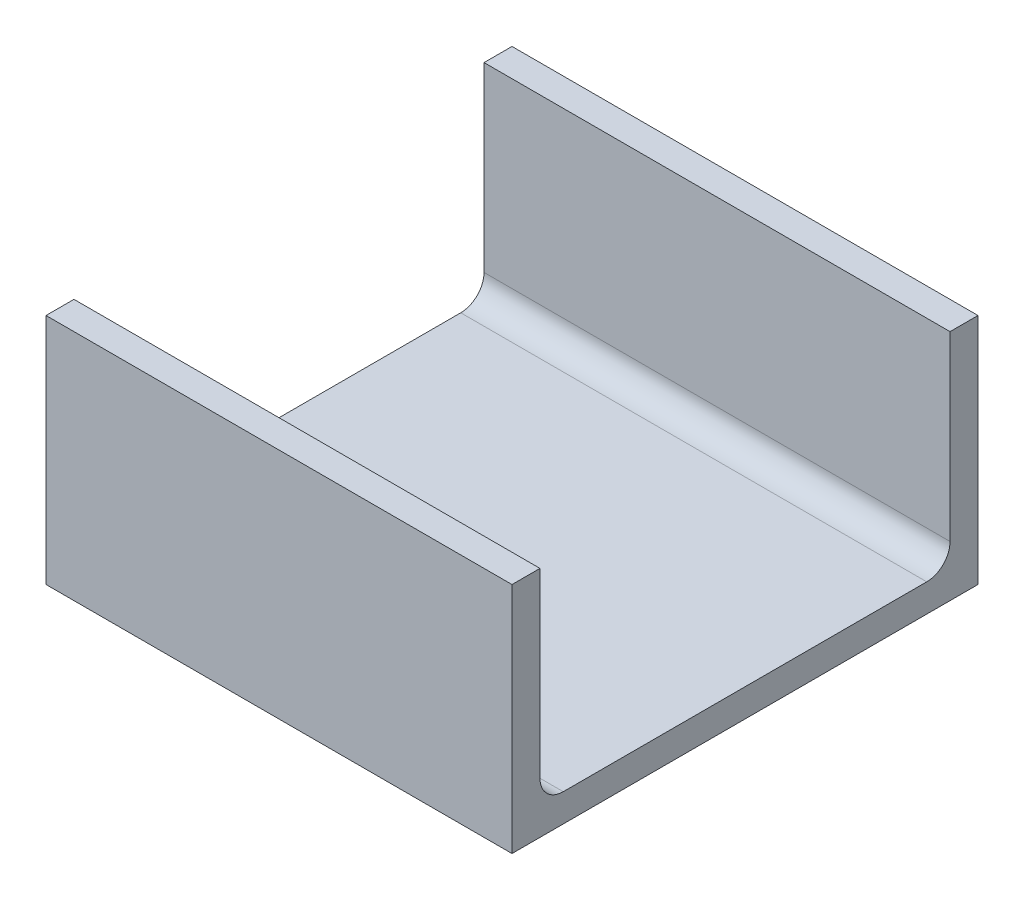
ISO-10303-21;
HEADER;
FILE_DESCRIPTION(('STEP AP214'),'2;1');
FILE_NAME('part.step','',(''),(''),'','','');
FILE_SCHEMA(('AUTOMOTIVE_DESIGN { 1 0 10303 214 1 1 1 1 }'));
ENDSEC;
DATA;
#1=APPLICATION_CONTEXT('core data for automotive mechanical design processes');
#2=APPLICATION_PROTOCOL_DEFINITION('international standard','automotive_design',2000,#1);
#3=PRODUCT_CONTEXT('',#1,'mechanical');
#4=PRODUCT('Part','Part','',(#3));
#5=PRODUCT_RELATED_PRODUCT_CATEGORY('part','',(#4));
#6=PRODUCT_DEFINITION_FORMATION('','',#4);
#7=PRODUCT_DEFINITION_CONTEXT('part definition',#1,'design');
#8=PRODUCT_DEFINITION('design','',#6,#7);
#9=PRODUCT_DEFINITION_SHAPE('','',#8);
#10=(LENGTH_UNIT() NAMED_UNIT(*) SI_UNIT(.MILLI.,.METRE.));
#11=(NAMED_UNIT(*) PLANE_ANGLE_UNIT() SI_UNIT($,.RADIAN.));
#12=(NAMED_UNIT(*) SI_UNIT($,.STERADIAN.) SOLID_ANGLE_UNIT());
#13=UNCERTAINTY_MEASURE_WITH_UNIT(LENGTH_MEASURE(1.E-05),#10,'distance_accuracy_value','');
#14=(GEOMETRIC_REPRESENTATION_CONTEXT(3) GLOBAL_UNCERTAINTY_ASSIGNED_CONTEXT((#13)) GLOBAL_UNIT_ASSIGNED_CONTEXT((#10,
#11,#12)) REPRESENTATION_CONTEXT('',''));
#15=CARTESIAN_POINT('',(0.,0.,0.));
#16=DIRECTION('',(0.,0.,1.));
#17=DIRECTION('',(1.,0.,0.));
#18=AXIS2_PLACEMENT_3D('',#15,#16,#17);
#19=CARTESIAN_POINT('',(50.8,-9.652,0.));
#20=DIRECTION('',(0.,1.,0.));
#21=DIRECTION('',(0.,0.,1.));
#22=AXIS2_PLACEMENT_3D('',#19,#20,#21);
#23=PLANE('',#22);
#24=DIRECTION('',(0.,0.,-1.));
#25=VECTOR('',#24,1.);
#26=CARTESIAN_POINT('',(0.,-9.652,0.));
#27=LINE('',#26,#25);
#28=CARTESIAN_POINT('',(0.,-9.652,19.812));
#29=VERTEX_POINT('',#28);
#30=CARTESIAN_POINT('',(0.,-9.652,-19.812));
#31=VERTEX_POINT('',#30);
#32=EDGE_CURVE('E155',#29,#31,#27,.T.);
#33=ORIENTED_EDGE('',*,*,#32,.F.);
#34=DIRECTION('',(-1.,0.,0.));
#35=VECTOR('',#34,1.);
#36=CARTESIAN_POINT('',(50.8,-9.652,19.812));
#37=LINE('',#36,#35);
#38=CARTESIAN_POINT('',(50.8,-9.652,19.812));
#39=VERTEX_POINT('',#38);
#40=EDGE_CURVE('E11',#39,#29,#37,.T.);
#41=ORIENTED_EDGE('',*,*,#40,.F.);
#42=DIRECTION('',(0.,0.,-1.));
#43=VECTOR('',#42,1.);
#44=CARTESIAN_POINT('',(50.8,-9.652,0.));
#45=LINE('',#44,#43);
#46=CARTESIAN_POINT('',(50.8,-9.652,-19.812));
#47=VERTEX_POINT('',#46);
#48=EDGE_CURVE('E187',#39,#47,#45,.T.);
#49=ORIENTED_EDGE('',*,*,#48,.T.);
#50=DIRECTION('',(-1.,0.,0.));
#51=VECTOR('',#50,1.);
#52=CARTESIAN_POINT('',(50.8,-9.652,-19.812));
#53=LINE('',#52,#51);
#54=EDGE_CURVE('E100',#47,#31,#53,.T.);
#55=ORIENTED_EDGE('',*,*,#54,.T.);
#56=EDGE_LOOP('',(#33,#41,#49,#55));
#57=FACE_BOUND('',#56,.T.);
#58=ADVANCED_FACE('F43',(#57),#23,.T.);
#59=CARTESIAN_POINT('',(50.8,-7.112,19.812));
#60=DIRECTION('',(-1.,0.,0.));
#61=DIRECTION('',(0.,0.,1.));
#62=AXIS2_PLACEMENT_3D('',#59,#60,#61);
#63=CYLINDRICAL_SURFACE('',#62,2.54);
#64=CARTESIAN_POINT('',(0.,-7.112,19.812));
#65=DIRECTION('',(1.,0.,0.));
#66=DIRECTION('',(0.,0.,-1.));
#67=AXIS2_PLACEMENT_3D('',#64,#65,#66);
#68=CIRCLE('',#67,2.54);
#69=CARTESIAN_POINT('',(0.,-7.11199999999998,22.352));
#70=VERTEX_POINT('',#69);
#71=EDGE_CURVE('E159',#29,#70,#68,.F.);
#72=ORIENTED_EDGE('',*,*,#71,.T.);
#73=DIRECTION('',(-1.,0.,0.));
#74=VECTOR('',#73,1.);
#75=CARTESIAN_POINT('',(50.8,-7.11199999999998,22.352));
#76=LINE('',#75,#74);
#77=CARTESIAN_POINT('',(50.8,-7.11199999999998,22.352));
#78=VERTEX_POINT('',#77);
#79=EDGE_CURVE('E52',#78,#70,#76,.T.);
#80=ORIENTED_EDGE('',*,*,#79,.F.);
#81=CARTESIAN_POINT('',(50.8,-7.112,19.812));
#82=DIRECTION('',(1.,0.,0.));
#83=DIRECTION('',(0.,0.,-1.));
#84=AXIS2_PLACEMENT_3D('',#81,#82,#83);
#85=CIRCLE('',#84,2.54);
#86=EDGE_CURVE('E234',#39,#78,#85,.F.);
#87=ORIENTED_EDGE('',*,*,#86,.F.);
#88=ORIENTED_EDGE('',*,*,#40,.T.);
#89=EDGE_LOOP('',(#72,#80,#87,#88));
#90=FACE_BOUND('',#89,.T.);
#91=ADVANCED_FACE('F250',(#90),#63,.F.);
#92=CARTESIAN_POINT('',(50.8,0.,22.352));
#93=DIRECTION('',(0.,0.,1.));
#94=DIRECTION('',(1.,0.,0.));
#95=AXIS2_PLACEMENT_3D('',#92,#93,#94);
#96=PLANE('',#95);
#97=DIRECTION('',(0.,1.,0.));
#98=VECTOR('',#97,1.);
#99=CARTESIAN_POINT('',(0.,0.,22.352));
#100=LINE('',#99,#98);
#101=CARTESIAN_POINT('',(0.,12.7,22.352));
#102=VERTEX_POINT('',#101);
#103=EDGE_CURVE('E162',#70,#102,#100,.T.);
#104=ORIENTED_EDGE('',*,*,#103,.T.);
#105=DIRECTION('',(-1.,0.,0.));
#106=VECTOR('',#105,1.);
#107=CARTESIAN_POINT('',(50.8,12.7,22.352));
#108=LINE('',#107,#106);
#109=CARTESIAN_POINT('',(50.8,12.7,22.352));
#110=VERTEX_POINT('',#109);
#111=EDGE_CURVE('E204',#110,#102,#108,.T.);
#112=ORIENTED_EDGE('',*,*,#111,.F.);
#113=DIRECTION('',(0.,1.,0.));
#114=VECTOR('',#113,1.);
#115=CARTESIAN_POINT('',(50.8,0.,22.352));
#116=LINE('',#115,#114);
#117=EDGE_CURVE('E214',#78,#110,#116,.T.);
#118=ORIENTED_EDGE('',*,*,#117,.F.);
#119=ORIENTED_EDGE('',*,*,#79,.T.);
#120=EDGE_LOOP('',(#104,#112,#118,#119));
#121=FACE_BOUND('',#120,.T.);
#122=ADVANCED_FACE('F212',(#121),#96,.F.);
#123=CARTESIAN_POINT('',(50.8,12.7,0.));
#124=DIRECTION('',(0.,1.,0.));
#125=DIRECTION('',(0.,0.,1.));
#126=AXIS2_PLACEMENT_3D('',#123,#124,#125);
#127=PLANE('',#126);
#128=DIRECTION('',(0.,0.,-1.));
#129=VECTOR('',#128,1.);
#130=CARTESIAN_POINT('',(0.,12.7,0.));
#131=LINE('',#130,#129);
#132=CARTESIAN_POINT('',(0.,12.7,25.4));
#133=VERTEX_POINT('',#132);
#134=EDGE_CURVE('E166',#133,#102,#131,.T.);
#135=ORIENTED_EDGE('',*,*,#134,.F.);
#136=DIRECTION('',(-1.,0.,0.));
#137=VECTOR('',#136,1.);
#138=CARTESIAN_POINT('',(50.8,12.7,25.4));
#139=LINE('',#138,#137);
#140=CARTESIAN_POINT('',(50.8,12.7,25.4));
#141=VERTEX_POINT('',#140);
#142=EDGE_CURVE('E201',#141,#133,#139,.T.);
#143=ORIENTED_EDGE('',*,*,#142,.F.);
#144=DIRECTION('',(0.,0.,-1.));
#145=VECTOR('',#144,1.);
#146=CARTESIAN_POINT('',(50.8,12.7,0.));
#147=LINE('',#146,#145);
#148=EDGE_CURVE('E146',#141,#110,#147,.T.);
#149=ORIENTED_EDGE('',*,*,#148,.T.);
#150=ORIENTED_EDGE('',*,*,#111,.T.);
#151=EDGE_LOOP('',(#135,#143,#149,#150));
#152=FACE_BOUND('',#151,.T.);
#153=ADVANCED_FACE('F223',(#152),#127,.T.);
#154=CARTESIAN_POINT('',(50.8,0.,25.4));
#155=DIRECTION('',(0.,0.,1.));
#156=DIRECTION('',(1.,0.,0.));
#157=AXIS2_PLACEMENT_3D('',#154,#155,#156);
#158=PLANE('',#157);
#159=DIRECTION('',(0.,1.,0.));
#160=VECTOR('',#159,1.);
#161=CARTESIAN_POINT('',(0.,0.,25.4));
#162=LINE('',#161,#160);
#163=CARTESIAN_POINT('',(0.,-12.7,25.4));
#164=VERTEX_POINT('',#163);
#165=EDGE_CURVE('E170',#164,#133,#162,.T.);
#166=ORIENTED_EDGE('',*,*,#165,.F.);
#167=DIRECTION('',(-1.,0.,0.));
#168=VECTOR('',#167,1.);
#169=CARTESIAN_POINT('',(50.8,-12.7,25.4));
#170=LINE('',#169,#168);
#171=CARTESIAN_POINT('',(50.8,-12.7,25.4));
#172=VERTEX_POINT('',#171);
#173=EDGE_CURVE('E198',#172,#164,#170,.T.);
#174=ORIENTED_EDGE('',*,*,#173,.F.);
#175=DIRECTION('',(0.,1.,0.));
#176=VECTOR('',#175,1.);
#177=CARTESIAN_POINT('',(50.8,0.,25.4));
#178=LINE('',#177,#176);
#179=EDGE_CURVE('E229',#172,#141,#178,.T.);
#180=ORIENTED_EDGE('',*,*,#179,.T.);
#181=ORIENTED_EDGE('',*,*,#142,.T.);
#182=EDGE_LOOP('',(#166,#174,#180,#181));
#183=FACE_BOUND('',#182,.T.);
#184=ADVANCED_FACE('F258',(#183),#158,.T.);
#185=CARTESIAN_POINT('',(50.8,-12.7,0.));
#186=DIRECTION('',(0.,1.,0.));
#187=DIRECTION('',(0.,0.,1.));
#188=AXIS2_PLACEMENT_3D('',#185,#186,#187);
#189=PLANE('',#188);
#190=DIRECTION('',(0.,0.,-1.));
#191=VECTOR('',#190,1.);
#192=CARTESIAN_POINT('',(0.,-12.7,0.));
#193=LINE('',#192,#191);
#194=CARTESIAN_POINT('',(0.,-12.7,-25.4));
#195=VERTEX_POINT('',#194);
#196=EDGE_CURVE('E174',#164,#195,#193,.T.);
#197=ORIENTED_EDGE('',*,*,#196,.T.);
#198=DIRECTION('',(-1.,0.,0.));
#199=VECTOR('',#198,1.);
#200=CARTESIAN_POINT('',(50.8,-12.7,-25.4));
#201=LINE('',#200,#199);
#202=CARTESIAN_POINT('',(50.8,-12.7,-25.4));
#203=VERTEX_POINT('',#202);
#204=EDGE_CURVE('E194',#203,#195,#201,.T.);
#205=ORIENTED_EDGE('',*,*,#204,.F.);
#206=DIRECTION('',(0.,0.,-1.));
#207=VECTOR('',#206,1.);
#208=CARTESIAN_POINT('',(50.8,-12.7,0.));
#209=LINE('',#208,#207);
#210=EDGE_CURVE('E232',#172,#203,#209,.T.);
#211=ORIENTED_EDGE('',*,*,#210,.F.);
#212=ORIENTED_EDGE('',*,*,#173,.T.);
#213=EDGE_LOOP('',(#197,#205,#211,#212));
#214=FACE_BOUND('',#213,.T.);
#215=ADVANCED_FACE('F242',(#214),#189,.F.);
#216=CARTESIAN_POINT('',(50.8,0.,-25.4));
#217=DIRECTION('',(0.,0.,1.));
#218=DIRECTION('',(1.,0.,0.));
#219=AXIS2_PLACEMENT_3D('',#216,#217,#218);
#220=PLANE('',#219);
#221=DIRECTION('',(0.,1.,0.));
#222=VECTOR('',#221,1.);
#223=CARTESIAN_POINT('',(0.,0.,-25.4));
#224=LINE('',#223,#222);
#225=CARTESIAN_POINT('',(0.,12.7,-25.4));
#226=VERTEX_POINT('',#225);
#227=EDGE_CURVE('E177',#195,#226,#224,.T.);
#228=ORIENTED_EDGE('',*,*,#227,.T.);
#229=DIRECTION('',(-1.,0.,0.));
#230=VECTOR('',#229,1.);
#231=CARTESIAN_POINT('',(50.8,12.7,-25.4));
#232=LINE('',#231,#230);
#233=CARTESIAN_POINT('',(50.8,12.7,-25.4));
#234=VERTEX_POINT('',#233);
#235=EDGE_CURVE('E137',#234,#226,#232,.T.);
#236=ORIENTED_EDGE('',*,*,#235,.F.);
#237=DIRECTION('',(0.,1.,0.));
#238=VECTOR('',#237,1.);
#239=CARTESIAN_POINT('',(50.8,0.,-25.4));
#240=LINE('',#239,#238);
#241=EDGE_CURVE('E142',#203,#234,#240,.T.);
#242=ORIENTED_EDGE('',*,*,#241,.F.);
#243=ORIENTED_EDGE('',*,*,#204,.T.);
#244=EDGE_LOOP('',(#228,#236,#242,#243));
#245=FACE_BOUND('',#244,.T.);
#246=ADVANCED_FACE('F245',(#245),#220,.F.);
#247=CARTESIAN_POINT('',(0.,12.7,-22.352));
#248=VERTEX_POINT('',#247);
#249=EDGE_CURVE('E131',#248,#226,#131,.T.);
#250=ORIENTED_EDGE('',*,*,#249,.F.);
#251=DIRECTION('',(-1.,0.,0.));
#252=VECTOR('',#251,1.);
#253=CARTESIAN_POINT('',(50.8,12.7,-22.352));
#254=LINE('',#253,#252);
#255=CARTESIAN_POINT('',(50.8,12.7,-22.352));
#256=VERTEX_POINT('',#255);
#257=EDGE_CURVE('E126',#256,#248,#254,.T.);
#258=ORIENTED_EDGE('',*,*,#257,.F.);
#259=EDGE_CURVE('E129',#256,#234,#147,.T.);
#260=ORIENTED_EDGE('',*,*,#259,.T.);
#261=ORIENTED_EDGE('',*,*,#235,.T.);
#262=EDGE_LOOP('',(#250,#258,#260,#261));
#263=FACE_BOUND('',#262,.T.);
#264=ADVANCED_FACE('F128',(#263),#127,.T.);
#265=CARTESIAN_POINT('',(50.8,0.,-22.352));
#266=DIRECTION('',(0.,0.,1.));
#267=DIRECTION('',(1.,0.,0.));
#268=AXIS2_PLACEMENT_3D('',#265,#266,#267);
#269=PLANE('',#268);
#270=DIRECTION('',(0.,1.,0.));
#271=VECTOR('',#270,1.);
#272=CARTESIAN_POINT('',(0.,0.,-22.352));
#273=LINE('',#272,#271);
#274=CARTESIAN_POINT('',(0.,-7.11199999999998,-22.352));
#275=VERTEX_POINT('',#274);
#276=EDGE_CURVE('E181',#275,#248,#273,.T.);
#277=ORIENTED_EDGE('',*,*,#276,.F.);
#278=DIRECTION('',(-1.,0.,0.));
#279=VECTOR('',#278,1.);
#280=CARTESIAN_POINT('',(50.8,-7.11199999999998,-22.352));
#281=LINE('',#280,#279);
#282=CARTESIAN_POINT('',(50.8,-7.11199999999998,-22.352));
#283=VERTEX_POINT('',#282);
#284=EDGE_CURVE('E93',#283,#275,#281,.T.);
#285=ORIENTED_EDGE('',*,*,#284,.F.);
#286=DIRECTION('',(0.,1.,0.));
#287=VECTOR('',#286,1.);
#288=CARTESIAN_POINT('',(50.8,0.,-22.352));
#289=LINE('',#288,#287);
#290=EDGE_CURVE('E140',#283,#256,#289,.T.);
#291=ORIENTED_EDGE('',*,*,#290,.T.);
#292=ORIENTED_EDGE('',*,*,#257,.T.);
#293=EDGE_LOOP('',(#277,#285,#291,#292));
#294=FACE_BOUND('',#293,.T.);
#295=ADVANCED_FACE('F147',(#294),#269,.T.);
#296=CARTESIAN_POINT('',(50.8,-7.112,-19.812));
#297=DIRECTION('',(-1.,0.,0.));
#298=DIRECTION('',(0.,0.,1.));
#299=AXIS2_PLACEMENT_3D('',#296,#297,#298);
#300=CYLINDRICAL_SURFACE('',#299,2.54);
#301=CARTESIAN_POINT('',(0.,-7.112,-19.812));
#302=DIRECTION('',(1.,0.,0.));
#303=DIRECTION('',(0.,0.,-1.));
#304=AXIS2_PLACEMENT_3D('',#301,#302,#303);
#305=CIRCLE('',#304,2.54);
#306=EDGE_CURVE('E184',#275,#31,#305,.F.);
#307=ORIENTED_EDGE('',*,*,#306,.T.);
#308=ORIENTED_EDGE('',*,*,#54,.F.);
#309=CARTESIAN_POINT('',(50.8,-7.112,-19.812));
#310=DIRECTION('',(1.,0.,0.));
#311=DIRECTION('',(0.,0.,-1.));
#312=AXIS2_PLACEMENT_3D('',#309,#310,#311);
#313=CIRCLE('',#312,2.54);
#314=EDGE_CURVE('E60',#283,#47,#313,.F.);
#315=ORIENTED_EDGE('',*,*,#314,.F.);
#316=ORIENTED_EDGE('',*,*,#284,.T.);
#317=EDGE_LOOP('',(#307,#308,#315,#316));
#318=FACE_BOUND('',#317,.T.);
#319=ADVANCED_FACE('F270',(#318),#300,.F.);
#320=CARTESIAN_POINT('',(50.8,0.,0.));
#321=DIRECTION('',(1.,0.,0.));
#322=DIRECTION('',(0.,0.,-1.));
#323=AXIS2_PLACEMENT_3D('',#320,#321,#322);
#324=PLANE('',#323);
#325=ORIENTED_EDGE('',*,*,#48,.F.);
#326=ORIENTED_EDGE('',*,*,#86,.T.);
#327=ORIENTED_EDGE('',*,*,#117,.T.);
#328=ORIENTED_EDGE('',*,*,#148,.F.);
#329=ORIENTED_EDGE('',*,*,#179,.F.);
#330=ORIENTED_EDGE('',*,*,#210,.T.);
#331=ORIENTED_EDGE('',*,*,#241,.T.);
#332=ORIENTED_EDGE('',*,*,#259,.F.);
#333=ORIENTED_EDGE('',*,*,#290,.F.);
#334=ORIENTED_EDGE('',*,*,#314,.T.);
#335=EDGE_LOOP('',(#325,#326,#327,#328,#329,#330,#331,#332,#333,#334));
#336=FACE_BOUND('',#335,.T.);
#337=ADVANCED_FACE('F139',(#336),#324,.T.);
#338=CARTESIAN_POINT('',(0.,0.,0.));
#339=DIRECTION('',(1.,0.,0.));
#340=DIRECTION('',(0.,0.,-1.));
#341=AXIS2_PLACEMENT_3D('',#338,#339,#340);
#342=PLANE('',#341);
#343=ORIENTED_EDGE('',*,*,#32,.T.);
#344=ORIENTED_EDGE('',*,*,#306,.F.);
#345=ORIENTED_EDGE('',*,*,#276,.T.);
#346=ORIENTED_EDGE('',*,*,#249,.T.);
#347=ORIENTED_EDGE('',*,*,#227,.F.);
#348=ORIENTED_EDGE('',*,*,#196,.F.);
#349=ORIENTED_EDGE('',*,*,#165,.T.);
#350=ORIENTED_EDGE('',*,*,#134,.T.);
#351=ORIENTED_EDGE('',*,*,#103,.F.);
#352=ORIENTED_EDGE('',*,*,#71,.F.);
#353=EDGE_LOOP('',(#343,#344,#345,#346,#347,#348,#349,#350,#351,#352));
#354=FACE_BOUND('',#353,.T.);
#355=ADVANCED_FACE('F218',(#354),#342,.F.);
#356=CLOSED_SHELL('',(#58,#91,#122,#153,#184,#215,#246,#264,#295,#319,#337,#355));
#357=MANIFOLD_SOLID_BREP('B2',#356);
#358=ADVANCED_BREP_SHAPE_REPRESENTATION('',(#18,#357),#14);
#359=SHAPE_DEFINITION_REPRESENTATION(#9,#358);
ENDSEC;
END-ISO-10303-21;
